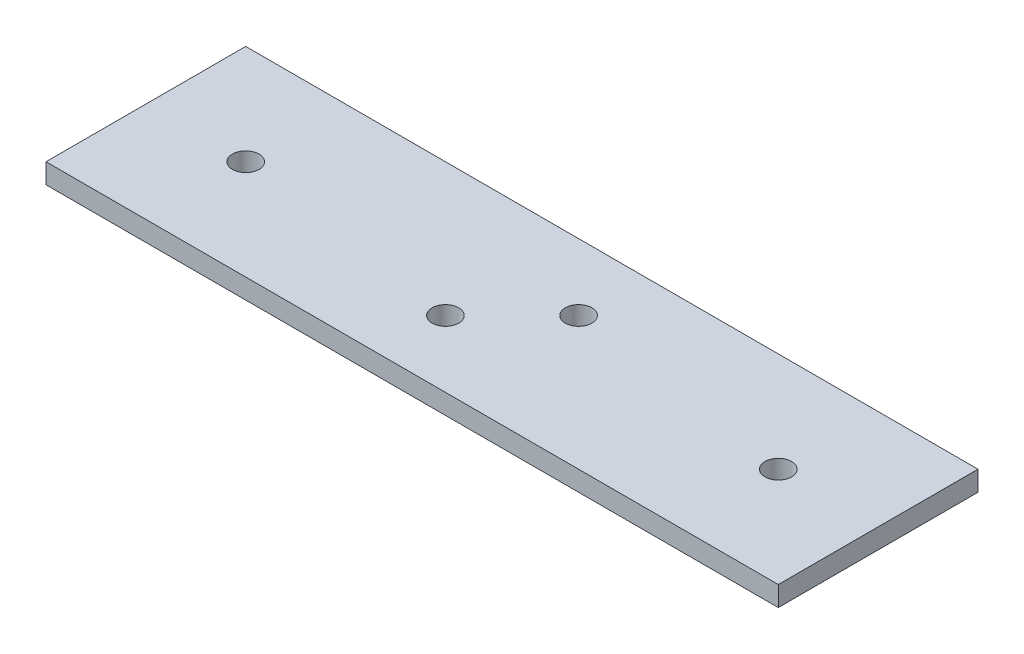
ISO-10303-21;
HEADER;
FILE_DESCRIPTION(('STEP AP214'),'2;1');
FILE_NAME('part.step','',(''),(''),'','','');
FILE_SCHEMA(('AUTOMOTIVE_DESIGN { 1 0 10303 214 1 1 1 1 }'));
ENDSEC;
DATA;
#1=APPLICATION_CONTEXT('core data for automotive mechanical design processes');
#2=APPLICATION_PROTOCOL_DEFINITION('international standard','automotive_design',2000,#1);
#3=PRODUCT_CONTEXT('',#1,'mechanical');
#4=PRODUCT('Part','Part','',(#3));
#5=PRODUCT_RELATED_PRODUCT_CATEGORY('part','',(#4));
#6=PRODUCT_DEFINITION_FORMATION('','',#4);
#7=PRODUCT_DEFINITION_CONTEXT('part definition',#1,'design');
#8=PRODUCT_DEFINITION('design','',#6,#7);
#9=PRODUCT_DEFINITION_SHAPE('','',#8);
#10=(LENGTH_UNIT() NAMED_UNIT(*) SI_UNIT(.MILLI.,.METRE.));
#11=(NAMED_UNIT(*) PLANE_ANGLE_UNIT() SI_UNIT($,.RADIAN.));
#12=(NAMED_UNIT(*) SI_UNIT($,.STERADIAN.) SOLID_ANGLE_UNIT());
#13=UNCERTAINTY_MEASURE_WITH_UNIT(LENGTH_MEASURE(1.E-05),#10,'distance_accuracy_value','');
#14=(GEOMETRIC_REPRESENTATION_CONTEXT(3) GLOBAL_UNCERTAINTY_ASSIGNED_CONTEXT((#13)) GLOBAL_UNIT_ASSIGNED_CONTEXT((#10,
#11,#12)) REPRESENTATION_CONTEXT('',''));
#15=CARTESIAN_POINT('',(0.,0.,0.));
#16=DIRECTION('',(0.,0.,1.));
#17=DIRECTION('',(1.,0.,0.));
#18=AXIS2_PLACEMENT_3D('',#15,#16,#17);
#19=CARTESIAN_POINT('',(0.,3.,0.));
#20=DIRECTION('',(0.,1.,0.));
#21=DIRECTION('',(0.,0.,1.));
#22=AXIS2_PLACEMENT_3D('',#19,#20,#21);
#23=PLANE('',#22);
#24=CARTESIAN_POINT('',(-40.,3.,0.));
#25=DIRECTION('',(0.,1.,0.));
#26=DIRECTION('',(0.,0.,1.));
#27=AXIS2_PLACEMENT_3D('',#24,#25,#26);
#28=CIRCLE('',#27,2.);
#29=CARTESIAN_POINT('',(-40.,3.,2.00000000000001));
#30=VERTEX_POINT('',#29);
#31=EDGE_CURVE('E142',#30,#30,#28,.T.);
#32=ORIENTED_EDGE('',*,*,#31,.F.);
#33=EDGE_LOOP('',(#32));
#34=FACE_BOUND('',#33,.T.);
#35=CARTESIAN_POINT('',(4.99999999999999,3.,-5.));
#36=DIRECTION('',(0.,1.,0.));
#37=DIRECTION('',(0.,0.,1.));
#38=AXIS2_PLACEMENT_3D('',#35,#36,#37);
#39=CIRCLE('',#38,2.);
#40=CARTESIAN_POINT('',(4.99999999999999,3.,-3.));
#41=VERTEX_POINT('',#40);
#42=EDGE_CURVE('E112',#41,#41,#39,.T.);
#43=ORIENTED_EDGE('',*,*,#42,.F.);
#44=EDGE_LOOP('',(#43));
#45=FACE_BOUND('',#44,.T.);
#46=DIRECTION('',(0.,0.,1.));
#47=VECTOR('',#46,1.);
#48=CARTESIAN_POINT('',(-55.,3.,15.));
#49=LINE('',#48,#47);
#50=CARTESIAN_POINT('',(-55.,3.,-15.));
#51=VERTEX_POINT('',#50);
#52=CARTESIAN_POINT('',(-55.,3.,15.));
#53=VERTEX_POINT('',#52);
#54=EDGE_CURVE('E92',#51,#53,#49,.T.);
#55=ORIENTED_EDGE('',*,*,#54,.T.);
#56=DIRECTION('',(1.,0.,0.));
#57=VECTOR('',#56,1.);
#58=CARTESIAN_POINT('',(55.,3.,15.));
#59=LINE('',#58,#57);
#60=CARTESIAN_POINT('',(55.,3.,15.));
#61=VERTEX_POINT('',#60);
#62=EDGE_CURVE('E87',#53,#61,#59,.T.);
#63=ORIENTED_EDGE('',*,*,#62,.T.);
#64=DIRECTION('',(0.,0.,-1.));
#65=VECTOR('',#64,1.);
#66=CARTESIAN_POINT('',(55.,3.,15.));
#67=LINE('',#66,#65);
#68=CARTESIAN_POINT('',(55.,3.,-15.));
#69=VERTEX_POINT('',#68);
#70=EDGE_CURVE('E90',#61,#69,#67,.T.);
#71=ORIENTED_EDGE('',*,*,#70,.T.);
#72=DIRECTION('',(-1.,0.,0.));
#73=VECTOR('',#72,1.);
#74=CARTESIAN_POINT('',(55.,3.,-15.));
#75=LINE('',#74,#73);
#76=EDGE_CURVE('E57',#69,#51,#75,.T.);
#77=ORIENTED_EDGE('',*,*,#76,.T.);
#78=EDGE_LOOP('',(#55,#63,#71,#77));
#79=FACE_BOUND('',#78,.T.);
#80=CARTESIAN_POINT('',(-5.00000000000001,3.,5.));
#81=DIRECTION('',(0.,1.,0.));
#82=DIRECTION('',(0.,0.,1.));
#83=AXIS2_PLACEMENT_3D('',#80,#81,#82);
#84=CIRCLE('',#83,2.);
#85=CARTESIAN_POINT('',(-5.00000000000001,3.,7.));
#86=VERTEX_POINT('',#85);
#87=EDGE_CURVE('E134',#86,#86,#84,.T.);
#88=ORIENTED_EDGE('',*,*,#87,.F.);
#89=EDGE_LOOP('',(#88));
#90=FACE_BOUND('',#89,.T.);
#91=CARTESIAN_POINT('',(40.,3.,0.));
#92=DIRECTION('',(0.,1.,0.));
#93=DIRECTION('',(0.,0.,-1.));
#94=AXIS2_PLACEMENT_3D('',#91,#92,#93);
#95=CIRCLE('',#94,2.);
#96=CARTESIAN_POINT('',(40.,3.,-2.));
#97=VERTEX_POINT('',#96);
#98=EDGE_CURVE('E150',#97,#97,#95,.T.);
#99=ORIENTED_EDGE('',*,*,#98,.F.);
#100=EDGE_LOOP('',(#99));
#101=FACE_BOUND('',#100,.T.);
#102=ADVANCED_FACE('F39',(#34,#45,#79,#90,#101),#23,.T.);
#103=CARTESIAN_POINT('',(0.,0.,0.));
#104=DIRECTION('',(0.,1.,0.));
#105=DIRECTION('',(0.,0.,1.));
#106=AXIS2_PLACEMENT_3D('',#103,#104,#105);
#107=PLANE('',#106);
#108=DIRECTION('',(0.,0.,1.));
#109=VECTOR('',#108,1.);
#110=CARTESIAN_POINT('',(-55.,0.,15.));
#111=LINE('',#110,#109);
#112=CARTESIAN_POINT('',(-55.,0.,-15.));
#113=VERTEX_POINT('',#112);
#114=CARTESIAN_POINT('',(-55.,0.,15.));
#115=VERTEX_POINT('',#114);
#116=EDGE_CURVE('E108',#113,#115,#111,.T.);
#117=ORIENTED_EDGE('',*,*,#116,.F.);
#118=DIRECTION('',(-1.,0.,0.));
#119=VECTOR('',#118,1.);
#120=CARTESIAN_POINT('',(55.,0.,-15.));
#121=LINE('',#120,#119);
#122=CARTESIAN_POINT('',(55.,0.,-15.));
#123=VERTEX_POINT('',#122);
#124=EDGE_CURVE('E80',#123,#113,#121,.T.);
#125=ORIENTED_EDGE('',*,*,#124,.F.);
#126=DIRECTION('',(0.,0.,-1.));
#127=VECTOR('',#126,1.);
#128=CARTESIAN_POINT('',(55.,0.,15.));
#129=LINE('',#128,#127);
#130=CARTESIAN_POINT('',(55.,0.,15.));
#131=VERTEX_POINT('',#130);
#132=EDGE_CURVE('E74',#131,#123,#129,.T.);
#133=ORIENTED_EDGE('',*,*,#132,.F.);
#134=DIRECTION('',(1.,0.,0.));
#135=VECTOR('',#134,1.);
#136=CARTESIAN_POINT('',(55.,0.,15.));
#137=LINE('',#136,#135);
#138=EDGE_CURVE('E97',#115,#131,#137,.T.);
#139=ORIENTED_EDGE('',*,*,#138,.F.);
#140=EDGE_LOOP('',(#117,#125,#133,#139));
#141=FACE_BOUND('',#140,.T.);
#142=CARTESIAN_POINT('',(4.99999999999999,0.,-5.));
#143=DIRECTION('',(0.,1.,0.));
#144=DIRECTION('',(0.,0.,1.));
#145=AXIS2_PLACEMENT_3D('',#142,#143,#144);
#146=CIRCLE('',#145,2.);
#147=CARTESIAN_POINT('',(4.99999999999999,0.,-3.));
#148=VERTEX_POINT('',#147);
#149=EDGE_CURVE('E130',#148,#148,#146,.T.);
#150=ORIENTED_EDGE('',*,*,#149,.T.);
#151=EDGE_LOOP('',(#150));
#152=FACE_BOUND('',#151,.T.);
#153=CARTESIAN_POINT('',(-5.00000000000001,0.,5.));
#154=DIRECTION('',(0.,1.,0.));
#155=DIRECTION('',(0.,0.,1.));
#156=AXIS2_PLACEMENT_3D('',#153,#154,#155);
#157=CIRCLE('',#156,2.);
#158=CARTESIAN_POINT('',(-5.00000000000001,0.,7.));
#159=VERTEX_POINT('',#158);
#160=EDGE_CURVE('E138',#159,#159,#157,.T.);
#161=ORIENTED_EDGE('',*,*,#160,.T.);
#162=EDGE_LOOP('',(#161));
#163=FACE_BOUND('',#162,.T.);
#164=CARTESIAN_POINT('',(-40.,0.,0.));
#165=DIRECTION('',(0.,1.,0.));
#166=DIRECTION('',(0.,0.,1.));
#167=AXIS2_PLACEMENT_3D('',#164,#165,#166);
#168=CIRCLE('',#167,2.);
#169=CARTESIAN_POINT('',(-40.,0.,2.00000000000001));
#170=VERTEX_POINT('',#169);
#171=EDGE_CURVE('E146',#170,#170,#168,.T.);
#172=ORIENTED_EDGE('',*,*,#171,.T.);
#173=EDGE_LOOP('',(#172));
#174=FACE_BOUND('',#173,.T.);
#175=CARTESIAN_POINT('',(40.,0.,0.));
#176=DIRECTION('',(0.,1.,0.));
#177=DIRECTION('',(0.,0.,-1.));
#178=AXIS2_PLACEMENT_3D('',#175,#176,#177);
#179=CIRCLE('',#178,2.);
#180=CARTESIAN_POINT('',(40.,0.,-2.));
#181=VERTEX_POINT('',#180);
#182=EDGE_CURVE('E154',#181,#181,#179,.T.);
#183=ORIENTED_EDGE('',*,*,#182,.T.);
#184=EDGE_LOOP('',(#183));
#185=FACE_BOUND('',#184,.T.);
#186=ADVANCED_FACE('F125',(#141,#152,#163,#174,#185),#107,.F.);
#187=CARTESIAN_POINT('',(-55.,3.,15.));
#188=DIRECTION('',(1.,0.,0.));
#189=DIRECTION('',(0.,0.,-1.));
#190=AXIS2_PLACEMENT_3D('',#187,#188,#189);
#191=PLANE('',#190);
#192=ORIENTED_EDGE('',*,*,#116,.T.);
#193=DIRECTION('',(0.,-1.,0.));
#194=VECTOR('',#193,1.);
#195=CARTESIAN_POINT('',(-55.,3.,15.));
#196=LINE('',#195,#194);
#197=EDGE_CURVE('E11',#53,#115,#196,.T.);
#198=ORIENTED_EDGE('',*,*,#197,.F.);
#199=ORIENTED_EDGE('',*,*,#54,.F.);
#200=DIRECTION('',(0.,-1.,0.));
#201=VECTOR('',#200,1.);
#202=CARTESIAN_POINT('',(-55.,3.,-15.));
#203=LINE('',#202,#201);
#204=EDGE_CURVE('E104',#51,#113,#203,.T.);
#205=ORIENTED_EDGE('',*,*,#204,.T.);
#206=EDGE_LOOP('',(#192,#198,#199,#205));
#207=FACE_BOUND('',#206,.T.);
#208=ADVANCED_FACE('F41',(#207),#191,.F.);
#209=CARTESIAN_POINT('',(55.,3.,15.));
#210=DIRECTION('',(0.,0.,-1.));
#211=DIRECTION('',(-1.,0.,0.));
#212=AXIS2_PLACEMENT_3D('',#209,#210,#211);
#213=PLANE('',#212);
#214=ORIENTED_EDGE('',*,*,#138,.T.);
#215=DIRECTION('',(0.,-1.,0.));
#216=VECTOR('',#215,1.);
#217=CARTESIAN_POINT('',(55.,3.,15.));
#218=LINE('',#217,#216);
#219=EDGE_CURVE('E49',#61,#131,#218,.T.);
#220=ORIENTED_EDGE('',*,*,#219,.F.);
#221=ORIENTED_EDGE('',*,*,#62,.F.);
#222=ORIENTED_EDGE('',*,*,#197,.T.);
#223=EDGE_LOOP('',(#214,#220,#221,#222));
#224=FACE_BOUND('',#223,.T.);
#225=ADVANCED_FACE('F96',(#224),#213,.F.);
#226=CARTESIAN_POINT('',(55.,3.,15.));
#227=DIRECTION('',(-1.,0.,0.));
#228=DIRECTION('',(0.,0.,1.));
#229=AXIS2_PLACEMENT_3D('',#226,#227,#228);
#230=PLANE('',#229);
#231=ORIENTED_EDGE('',*,*,#132,.T.);
#232=DIRECTION('',(0.,-1.,0.));
#233=VECTOR('',#232,1.);
#234=CARTESIAN_POINT('',(55.,3.,-15.));
#235=LINE('',#234,#233);
#236=EDGE_CURVE('E99',#69,#123,#235,.T.);
#237=ORIENTED_EDGE('',*,*,#236,.F.);
#238=ORIENTED_EDGE('',*,*,#70,.F.);
#239=ORIENTED_EDGE('',*,*,#219,.T.);
#240=EDGE_LOOP('',(#231,#237,#238,#239));
#241=FACE_BOUND('',#240,.T.);
#242=ADVANCED_FACE('F100',(#241),#230,.F.);
#243=CARTESIAN_POINT('',(55.,3.,-15.));
#244=DIRECTION('',(0.,0.,1.));
#245=DIRECTION('',(1.,0.,0.));
#246=AXIS2_PLACEMENT_3D('',#243,#244,#245);
#247=PLANE('',#246);
#248=ORIENTED_EDGE('',*,*,#124,.T.);
#249=ORIENTED_EDGE('',*,*,#204,.F.);
#250=ORIENTED_EDGE('',*,*,#76,.F.);
#251=ORIENTED_EDGE('',*,*,#236,.T.);
#252=EDGE_LOOP('',(#248,#249,#250,#251));
#253=FACE_BOUND('',#252,.T.);
#254=ADVANCED_FACE('F122',(#253),#247,.F.);
#255=CARTESIAN_POINT('',(4.99999999999999,3.,-5.));
#256=DIRECTION('',(0.,-1.,0.));
#257=DIRECTION('',(0.,0.,-1.));
#258=AXIS2_PLACEMENT_3D('',#255,#256,#257);
#259=CYLINDRICAL_SURFACE('',#258,2.);
#260=ORIENTED_EDGE('',*,*,#42,.T.);
#261=EDGE_LOOP('',(#260));
#262=FACE_BOUND('',#261,.T.);
#263=ORIENTED_EDGE('',*,*,#149,.F.);
#264=EDGE_LOOP('',(#263));
#265=FACE_BOUND('',#264,.T.);
#266=ADVANCED_FACE('F175',(#262,#265),#259,.F.);
#267=CARTESIAN_POINT('',(-5.00000000000001,3.,5.));
#268=DIRECTION('',(0.,-1.,0.));
#269=DIRECTION('',(0.,0.,-1.));
#270=AXIS2_PLACEMENT_3D('',#267,#268,#269);
#271=CYLINDRICAL_SURFACE('',#270,2.);
#272=ORIENTED_EDGE('',*,*,#87,.T.);
#273=EDGE_LOOP('',(#272));
#274=FACE_BOUND('',#273,.T.);
#275=ORIENTED_EDGE('',*,*,#160,.F.);
#276=EDGE_LOOP('',(#275));
#277=FACE_BOUND('',#276,.T.);
#278=ADVANCED_FACE('F221',(#274,#277),#271,.F.);
#279=CARTESIAN_POINT('',(-40.,3.,0.));
#280=DIRECTION('',(0.,-1.,0.));
#281=DIRECTION('',(0.,0.,-1.));
#282=AXIS2_PLACEMENT_3D('',#279,#280,#281);
#283=CYLINDRICAL_SURFACE('',#282,2.);
#284=ORIENTED_EDGE('',*,*,#31,.T.);
#285=EDGE_LOOP('',(#284));
#286=FACE_BOUND('',#285,.T.);
#287=ORIENTED_EDGE('',*,*,#171,.F.);
#288=EDGE_LOOP('',(#287));
#289=FACE_BOUND('',#288,.T.);
#290=ADVANCED_FACE('F229',(#286,#289),#283,.F.);
#291=CARTESIAN_POINT('',(40.,3.,0.));
#292=DIRECTION('',(0.,-1.,0.));
#293=DIRECTION('',(0.,0.,-1.));
#294=AXIS2_PLACEMENT_3D('',#291,#292,#293);
#295=CYLINDRICAL_SURFACE('',#294,2.);
#296=ORIENTED_EDGE('',*,*,#98,.T.);
#297=EDGE_LOOP('',(#296));
#298=FACE_BOUND('',#297,.T.);
#299=ORIENTED_EDGE('',*,*,#182,.F.);
#300=EDGE_LOOP('',(#299));
#301=FACE_BOUND('',#300,.T.);
#302=ADVANCED_FACE('F162',(#298,#301),#295,.F.);
#303=CLOSED_SHELL('',(#102,#186,#208,#225,#242,#254,#266,#278,#290,#302));
#304=MANIFOLD_SOLID_BREP('B2',#303);
#305=ADVANCED_BREP_SHAPE_REPRESENTATION('',(#18,#304),#14);
#306=SHAPE_DEFINITION_REPRESENTATION(#9,#305);
ENDSEC;
END-ISO-10303-21;
